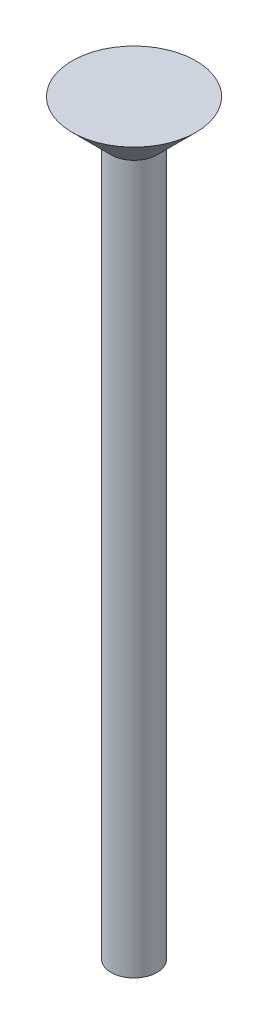
ISO-10303-21;
HEADER;
FILE_DESCRIPTION(('STEP AP214'),'2;1');
FILE_NAME('part.step','',(''),(''),'','','');
FILE_SCHEMA(('AUTOMOTIVE_DESIGN { 1 0 10303 214 1 1 1 1 }'));
ENDSEC;
DATA;
#1=APPLICATION_CONTEXT('core data for automotive mechanical design processes');
#2=APPLICATION_PROTOCOL_DEFINITION('international standard','automotive_design',2000,#1);
#3=PRODUCT_CONTEXT('',#1,'mechanical');
#4=PRODUCT('Part','Part','',(#3));
#5=PRODUCT_RELATED_PRODUCT_CATEGORY('part','',(#4));
#6=PRODUCT_DEFINITION_FORMATION('','',#4);
#7=PRODUCT_DEFINITION_CONTEXT('part definition',#1,'design');
#8=PRODUCT_DEFINITION('design','',#6,#7);
#9=PRODUCT_DEFINITION_SHAPE('','',#8);
#10=(LENGTH_UNIT() NAMED_UNIT(*) SI_UNIT(.MILLI.,.METRE.));
#11=(NAMED_UNIT(*) PLANE_ANGLE_UNIT() SI_UNIT($,.RADIAN.));
#12=(NAMED_UNIT(*) SI_UNIT($,.STERADIAN.) SOLID_ANGLE_UNIT());
#13=UNCERTAINTY_MEASURE_WITH_UNIT(LENGTH_MEASURE(1.E-05),#10,'distance_accuracy_value','');
#14=(GEOMETRIC_REPRESENTATION_CONTEXT(3) GLOBAL_UNCERTAINTY_ASSIGNED_CONTEXT((#13)) GLOBAL_UNIT_ASSIGNED_CONTEXT((#10,
#11,#12)) REPRESENTATION_CONTEXT('',''));
#15=CARTESIAN_POINT('',(0.,0.,0.));
#16=DIRECTION('',(0.,0.,1.));
#17=DIRECTION('',(1.,0.,0.));
#18=AXIS2_PLACEMENT_3D('',#15,#16,#17);
#19=CARTESIAN_POINT('',(6.65829368029737,32.7419219330855,0.));
#20=DIRECTION('',(0.,1.,0.));
#21=DIRECTION('',(-1.,0.,0.));
#22=AXIS2_PLACEMENT_3D('',#19,#20,#21);
#23=CONICAL_SURFACE('',#22,1.65100000000001,0.785398163397405);
#24=CARTESIAN_POINT('',(6.65829368029737,35.5359219330855,0.));
#25=DIRECTION('',(0.,-1.,0.));
#26=DIRECTION('',(1.,0.,0.));
#27=AXIS2_PLACEMENT_3D('',#24,#25,#26);
#28=CIRCLE('',#27,4.44499999999977);
#29=CARTESIAN_POINT('',(11.1032936802971,35.5359219330855,0.));
#30=VERTEX_POINT('',#29);
#31=EDGE_CURVE('E10',#30,#30,#28,.T.);
#32=ORIENTED_EDGE('',*,*,#31,.T.);
#33=EDGE_LOOP('',(#32));
#34=FACE_BOUND('',#33,.T.);
#35=CARTESIAN_POINT('',(6.65829368029737,32.7419219330855,0.));
#36=DIRECTION('',(0.,-1.,0.));
#37=DIRECTION('',(1.,0.,0.));
#38=AXIS2_PLACEMENT_3D('',#35,#36,#37);
#39=CIRCLE('',#38,1.65100000000001);
#40=CARTESIAN_POINT('',(8.30929368029737,32.7419219330855,0.));
#41=VERTEX_POINT('',#40);
#42=EDGE_CURVE('E49',#41,#41,#39,.T.);
#43=ORIENTED_EDGE('',*,*,#42,.F.);
#44=EDGE_LOOP('',(#43));
#45=FACE_BOUND('',#44,.T.);
#46=ADVANCED_FACE('F37',(#34,#45),#23,.T.);
#47=CARTESIAN_POINT('',(6.65829368029737,35.5359219330855,0.));
#48=DIRECTION('',(0.,1.,0.));
#49=DIRECTION('',(-1.,0.,0.));
#50=AXIS2_PLACEMENT_3D('',#47,#48,#49);
#51=PLANE('',#50);
#52=ORIENTED_EDGE('',*,*,#31,.F.);
#53=EDGE_LOOP('',(#52));
#54=FACE_BOUND('',#53,.T.);
#55=ADVANCED_FACE('F61',(#54),#51,.T.);
#56=CARTESIAN_POINT('',(8.30929368029738,-18.0580780669145,0.));
#57=DIRECTION('',(0.,-1.,0.));
#58=DIRECTION('',(1.,0.,0.));
#59=AXIS2_PLACEMENT_3D('',#56,#57,#58);
#60=PLANE('',#59);
#61=CARTESIAN_POINT('',(6.65829368029738,-18.0580780669145,0.));
#62=DIRECTION('',(0.,-1.,0.));
#63=DIRECTION('',(1.,0.,0.));
#64=AXIS2_PLACEMENT_3D('',#61,#62,#63);
#65=CIRCLE('',#64,1.651);
#66=CARTESIAN_POINT('',(8.30929368029738,-18.0580780669145,0.));
#67=VERTEX_POINT('',#66);
#68=EDGE_CURVE('E44',#67,#67,#65,.T.);
#69=ORIENTED_EDGE('',*,*,#68,.T.);
#70=EDGE_LOOP('',(#69));
#71=FACE_BOUND('',#70,.T.);
#72=ADVANCED_FACE('F65',(#71),#60,.T.);
#73=CARTESIAN_POINT('',(6.65829368029738,-18.0580780669145,0.));
#74=DIRECTION('',(0.,-1.,0.));
#75=DIRECTION('',(1.,0.,0.));
#76=AXIS2_PLACEMENT_3D('',#73,#74,#75);
#77=CYLINDRICAL_SURFACE('',#76,1.651);
#78=ORIENTED_EDGE('',*,*,#42,.T.);
#79=EDGE_LOOP('',(#78));
#80=FACE_BOUND('',#79,.T.);
#81=ORIENTED_EDGE('',*,*,#68,.F.);
#82=EDGE_LOOP('',(#81));
#83=FACE_BOUND('',#82,.T.);
#84=ADVANCED_FACE('F57',(#80,#83),#77,.T.);
#85=CLOSED_SHELL('',(#46,#55,#72,#84));
#86=MANIFOLD_SOLID_BREP('B2',#85);
#87=ADVANCED_BREP_SHAPE_REPRESENTATION('',(#18,#86),#14);
#88=SHAPE_DEFINITION_REPRESENTATION(#9,#87);
ENDSEC;
END-ISO-10303-21;
